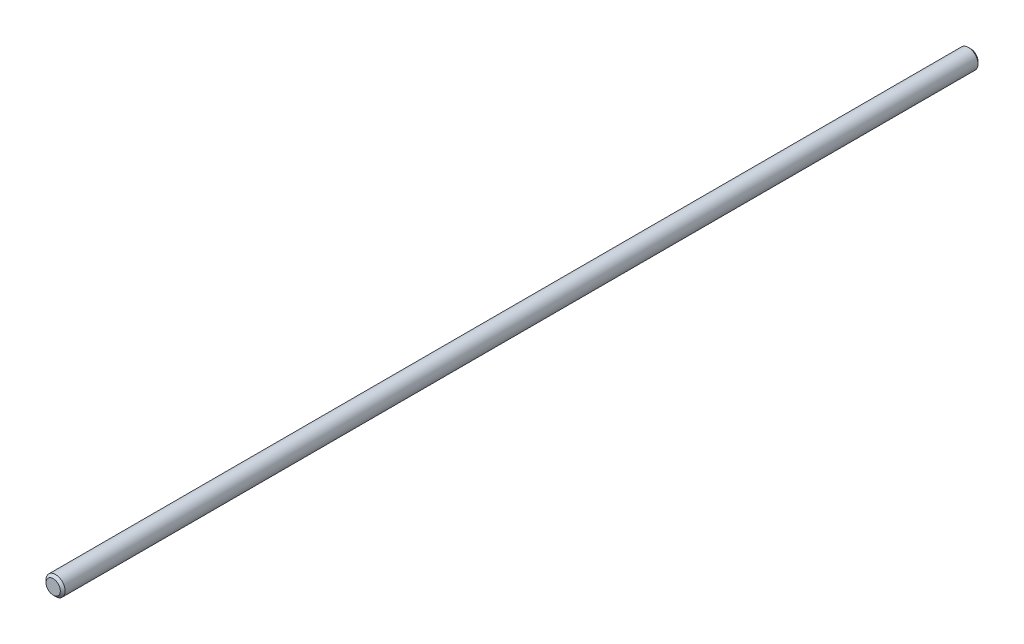
ISO-10303-21;
HEADER;
FILE_DESCRIPTION(('STEP AP214'),'2;1');
FILE_NAME('part.step','',(''),(''),'','','');
FILE_SCHEMA(('AUTOMOTIVE_DESIGN { 1 0 10303 214 1 1 1 1 }'));
ENDSEC;
DATA;
#1=APPLICATION_CONTEXT('core data for automotive mechanical design processes');
#2=APPLICATION_PROTOCOL_DEFINITION('international standard','automotive_design',2000,#1);
#3=PRODUCT_CONTEXT('',#1,'mechanical');
#4=PRODUCT('Part','Part','',(#3));
#5=PRODUCT_RELATED_PRODUCT_CATEGORY('part','',(#4));
#6=PRODUCT_DEFINITION_FORMATION('','',#4);
#7=PRODUCT_DEFINITION_CONTEXT('part definition',#1,'design');
#8=PRODUCT_DEFINITION('design','',#6,#7);
#9=PRODUCT_DEFINITION_SHAPE('','',#8);
#10=(LENGTH_UNIT() NAMED_UNIT(*) SI_UNIT(.MILLI.,.METRE.));
#11=(NAMED_UNIT(*) PLANE_ANGLE_UNIT() SI_UNIT($,.RADIAN.));
#12=(NAMED_UNIT(*) SI_UNIT($,.STERADIAN.) SOLID_ANGLE_UNIT());
#13=UNCERTAINTY_MEASURE_WITH_UNIT(LENGTH_MEASURE(1.E-05),#10,'distance_accuracy_value','');
#14=(GEOMETRIC_REPRESENTATION_CONTEXT(3) GLOBAL_UNCERTAINTY_ASSIGNED_CONTEXT((#13)) GLOBAL_UNIT_ASSIGNED_CONTEXT((#10,
#11,#12)) REPRESENTATION_CONTEXT('',''));
#15=CARTESIAN_POINT('',(0.,0.,0.));
#16=DIRECTION('',(0.,0.,1.));
#17=DIRECTION('',(1.,0.,0.));
#18=AXIS2_PLACEMENT_3D('',#15,#16,#17);
#19=CARTESIAN_POINT('',(0.,0.,228.6));
#20=DIRECTION('',(0.,0.,-1.));
#21=DIRECTION('',(-1.,0.,0.));
#22=AXIS2_PLACEMENT_3D('',#19,#20,#21);
#23=PLANE('',#22);
#24=CARTESIAN_POINT('',(0.,0.,228.6));
#25=DIRECTION('',(0.,0.,-1.));
#26=DIRECTION('',(-1.,0.,0.));
#27=AXIS2_PLACEMENT_3D('',#24,#25,#26);
#28=CIRCLE('',#27,3.57187500000006);
#29=CARTESIAN_POINT('',(-3.57187500000006,0.,228.6));
#30=VERTEX_POINT('',#29);
#31=EDGE_CURVE('E10',#30,#30,#28,.F.);
#32=ORIENTED_EDGE('',*,*,#31,.T.);
#33=EDGE_LOOP('',(#32));
#34=FACE_BOUND('',#33,.T.);
#35=ADVANCED_FACE('F39',(#34),#23,.F.);
#36=CARTESIAN_POINT('',(0.,0.,228.6));
#37=DIRECTION('',(0.,0.,1.));
#38=DIRECTION('',(1.,0.,0.));
#39=AXIS2_PLACEMENT_3D('',#36,#37,#38);
#40=CYLINDRICAL_SURFACE('',#39,4.76250000000008);
#41=CARTESIAN_POINT('',(0.,0.,-227.409375));
#42=DIRECTION('',(0.,0.,1.));
#43=DIRECTION('',(1.,0.,0.));
#44=AXIS2_PLACEMENT_3D('',#41,#42,#43);
#45=CIRCLE('',#44,4.76250000000008);
#46=CARTESIAN_POINT('',(4.76250000000008,0.,-227.409375));
#47=VERTEX_POINT('',#46);
#48=EDGE_CURVE('E50',#47,#47,#45,.T.);
#49=ORIENTED_EDGE('',*,*,#48,.T.);
#50=EDGE_LOOP('',(#49));
#51=FACE_BOUND('',#50,.T.);
#52=CARTESIAN_POINT('',(0.,0.,227.409375));
#53=DIRECTION('',(0.,0.,-1.));
#54=DIRECTION('',(-1.,0.,0.));
#55=AXIS2_PLACEMENT_3D('',#52,#53,#54);
#56=CIRCLE('',#55,4.76250000000008);
#57=CARTESIAN_POINT('',(-4.76250000000008,0.,227.409375));
#58=VERTEX_POINT('',#57);
#59=EDGE_CURVE('E54',#58,#58,#56,.T.);
#60=ORIENTED_EDGE('',*,*,#59,.T.);
#61=EDGE_LOOP('',(#60));
#62=FACE_BOUND('',#61,.T.);
#63=ADVANCED_FACE('F60',(#51,#62),#40,.T.);
#64=CARTESIAN_POINT('',(0.,0.,-228.6));
#65=DIRECTION('',(0.,0.,1.));
#66=DIRECTION('',(1.,0.,0.));
#67=AXIS2_PLACEMENT_3D('',#64,#65,#66);
#68=PLANE('',#67);
#69=CARTESIAN_POINT('',(0.,0.,-228.6));
#70=DIRECTION('',(0.,0.,1.));
#71=DIRECTION('',(1.,0.,0.));
#72=AXIS2_PLACEMENT_3D('',#69,#70,#71);
#73=CIRCLE('',#72,3.57187500000006);
#74=CARTESIAN_POINT('',(3.57187500000006,0.,-228.6));
#75=VERTEX_POINT('',#74);
#76=EDGE_CURVE('E46',#75,#75,#73,.F.);
#77=ORIENTED_EDGE('',*,*,#76,.T.);
#78=EDGE_LOOP('',(#77));
#79=FACE_BOUND('',#78,.T.);
#80=ADVANCED_FACE('F68',(#79),#68,.F.);
#81=CARTESIAN_POINT('',(0.,0.,-227.409375));
#82=DIRECTION('',(0.,0.,1.));
#83=DIRECTION('',(1.,0.,0.));
#84=AXIS2_PLACEMENT_3D('',#81,#82,#83);
#85=CONICAL_SURFACE('',#84,4.76250000000008,0.785398163397436);
#86=ORIENTED_EDGE('',*,*,#76,.F.);
#87=EDGE_LOOP('',(#86));
#88=FACE_BOUND('',#87,.T.);
#89=ORIENTED_EDGE('',*,*,#48,.F.);
#90=EDGE_LOOP('',(#89));
#91=FACE_BOUND('',#90,.T.);
#92=ADVANCED_FACE('F64',(#88,#91),#85,.T.);
#93=CARTESIAN_POINT('',(0.,0.,228.6));
#94=DIRECTION('',(0.,0.,-1.));
#95=DIRECTION('',(-1.,0.,0.));
#96=AXIS2_PLACEMENT_3D('',#93,#94,#95);
#97=CONICAL_SURFACE('',#96,3.57187500000006,0.785398163397436);
#98=ORIENTED_EDGE('',*,*,#59,.F.);
#99=EDGE_LOOP('',(#98));
#100=FACE_BOUND('',#99,.T.);
#101=ORIENTED_EDGE('',*,*,#31,.F.);
#102=EDGE_LOOP('',(#101));
#103=FACE_BOUND('',#102,.T.);
#104=ADVANCED_FACE('F41',(#100,#103),#97,.T.);
#105=CLOSED_SHELL('',(#35,#63,#80,#92,#104));
#106=MANIFOLD_SOLID_BREP('B2',#105);
#107=ADVANCED_BREP_SHAPE_REPRESENTATION('',(#18,#106),#14);
#108=SHAPE_DEFINITION_REPRESENTATION(#9,#107);
ENDSEC;
END-ISO-10303-21;
